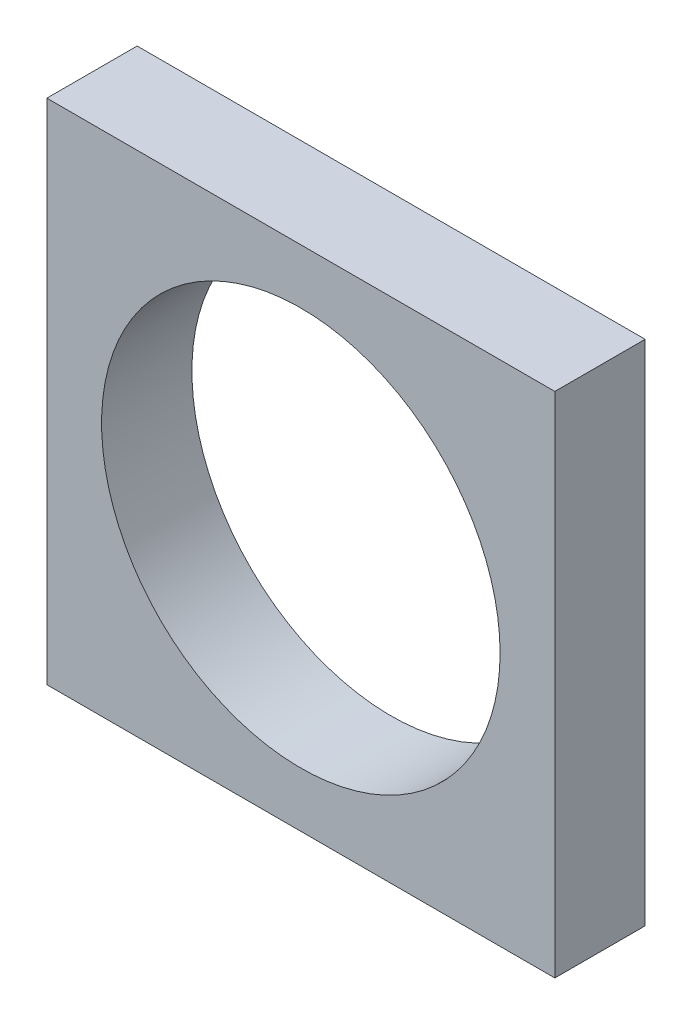
ISO-10303-21;
HEADER;
FILE_DESCRIPTION(('STEP AP214'),'2;1');
FILE_NAME('part.step','',(''),(''),'','','');
FILE_SCHEMA(('AUTOMOTIVE_DESIGN { 1 0 10303 214 1 1 1 1 }'));
ENDSEC;
DATA;
#1=APPLICATION_CONTEXT('core data for automotive mechanical design processes');
#2=APPLICATION_PROTOCOL_DEFINITION('international standard','automotive_design',2000,#1);
#3=PRODUCT_CONTEXT('',#1,'mechanical');
#4=PRODUCT('Part','Part','',(#3));
#5=PRODUCT_RELATED_PRODUCT_CATEGORY('part','',(#4));
#6=PRODUCT_DEFINITION_FORMATION('','',#4);
#7=PRODUCT_DEFINITION_CONTEXT('part definition',#1,'design');
#8=PRODUCT_DEFINITION('design','',#6,#7);
#9=PRODUCT_DEFINITION_SHAPE('','',#8);
#10=(LENGTH_UNIT() NAMED_UNIT(*) SI_UNIT(.MILLI.,.METRE.));
#11=(NAMED_UNIT(*) PLANE_ANGLE_UNIT() SI_UNIT($,.RADIAN.));
#12=(NAMED_UNIT(*) SI_UNIT($,.STERADIAN.) SOLID_ANGLE_UNIT());
#13=UNCERTAINTY_MEASURE_WITH_UNIT(LENGTH_MEASURE(1.E-05),#10,'distance_accuracy_value','');
#14=(GEOMETRIC_REPRESENTATION_CONTEXT(3) GLOBAL_UNCERTAINTY_ASSIGNED_CONTEXT((#13)) GLOBAL_UNIT_ASSIGNED_CONTEXT((#10,
#11,#12)) REPRESENTATION_CONTEXT('',''));
#15=CARTESIAN_POINT('',(0.,0.,0.));
#16=DIRECTION('',(0.,0.,1.));
#17=DIRECTION('',(1.,0.,0.));
#18=AXIS2_PLACEMENT_3D('',#15,#16,#17);
#19=CARTESIAN_POINT('',(0.,0.,8.));
#20=DIRECTION('',(0.,0.,-1.));
#21=DIRECTION('',(-1.,0.,0.));
#22=AXIS2_PLACEMENT_3D('',#19,#20,#21);
#23=PLANE('',#22);
#24=DIRECTION('',(0.,1.,0.));
#25=VECTOR('',#24,1.);
#26=CARTESIAN_POINT('',(22.5,-22.5,8.));
#27=LINE('',#26,#25);
#28=CARTESIAN_POINT('',(22.5,-22.5,8.));
#29=VERTEX_POINT('',#28);
#30=CARTESIAN_POINT('',(22.5,22.5,8.));
#31=VERTEX_POINT('',#30);
#32=EDGE_CURVE('E85',#29,#31,#27,.T.);
#33=ORIENTED_EDGE('',*,*,#32,.T.);
#34=DIRECTION('',(-1.,0.,0.));
#35=VECTOR('',#34,1.);
#36=CARTESIAN_POINT('',(-22.5,22.5,8.));
#37=LINE('',#36,#35);
#38=CARTESIAN_POINT('',(-22.5,22.5,8.));
#39=VERTEX_POINT('',#38);
#40=EDGE_CURVE('E80',#31,#39,#37,.T.);
#41=ORIENTED_EDGE('',*,*,#40,.T.);
#42=DIRECTION('',(0.,-1.,0.));
#43=VECTOR('',#42,1.);
#44=CARTESIAN_POINT('',(-22.5,-22.5,8.));
#45=LINE('',#44,#43);
#46=CARTESIAN_POINT('',(-22.5,-22.5,8.));
#47=VERTEX_POINT('',#46);
#48=EDGE_CURVE('E83',#39,#47,#45,.T.);
#49=ORIENTED_EDGE('',*,*,#48,.T.);
#50=DIRECTION('',(1.,0.,0.));
#51=VECTOR('',#50,1.);
#52=CARTESIAN_POINT('',(-22.5,-22.5,8.));
#53=LINE('',#52,#51);
#54=EDGE_CURVE('E50',#47,#29,#53,.T.);
#55=ORIENTED_EDGE('',*,*,#54,.T.);
#56=EDGE_LOOP('',(#33,#41,#49,#55));
#57=FACE_BOUND('',#56,.T.);
#58=CARTESIAN_POINT('',(0.,0.,8.));
#59=DIRECTION('',(0.,0.,1.));
#60=DIRECTION('',(1.,0.,0.));
#61=AXIS2_PLACEMENT_3D('',#58,#59,#60);
#62=CIRCLE('',#61,17.65);
#63=CARTESIAN_POINT('',(17.65,0.,8.));
#64=VERTEX_POINT('',#63);
#65=EDGE_CURVE('E100',#64,#64,#62,.T.);
#66=ORIENTED_EDGE('',*,*,#65,.F.);
#67=EDGE_LOOP('',(#66));
#68=FACE_BOUND('',#67,.T.);
#69=ADVANCED_FACE('F33',(#57,#68),#23,.F.);
#70=CARTESIAN_POINT('',(0.,0.,0.));
#71=DIRECTION('',(0.,0.,-1.));
#72=DIRECTION('',(-1.,0.,0.));
#73=AXIS2_PLACEMENT_3D('',#70,#71,#72);
#74=PLANE('',#73);
#75=DIRECTION('',(0.,1.,0.));
#76=VECTOR('',#75,1.);
#77=CARTESIAN_POINT('',(22.5,-22.5,0.));
#78=LINE('',#77,#76);
#79=CARTESIAN_POINT('',(22.5,-22.5,0.));
#80=VERTEX_POINT('',#79);
#81=CARTESIAN_POINT('',(22.5,22.5,0.));
#82=VERTEX_POINT('',#81);
#83=EDGE_CURVE('E97',#80,#82,#78,.T.);
#84=ORIENTED_EDGE('',*,*,#83,.F.);
#85=DIRECTION('',(1.,0.,0.));
#86=VECTOR('',#85,1.);
#87=CARTESIAN_POINT('',(-22.5,-22.5,0.));
#88=LINE('',#87,#86);
#89=CARTESIAN_POINT('',(-22.5,-22.5,0.));
#90=VERTEX_POINT('',#89);
#91=EDGE_CURVE('E73',#90,#80,#88,.T.);
#92=ORIENTED_EDGE('',*,*,#91,.F.);
#93=DIRECTION('',(0.,-1.,0.));
#94=VECTOR('',#93,1.);
#95=CARTESIAN_POINT('',(-22.5,-22.5,0.));
#96=LINE('',#95,#94);
#97=CARTESIAN_POINT('',(-22.5,22.5,0.));
#98=VERTEX_POINT('',#97);
#99=EDGE_CURVE('E67',#98,#90,#96,.T.);
#100=ORIENTED_EDGE('',*,*,#99,.F.);
#101=DIRECTION('',(-1.,0.,0.));
#102=VECTOR('',#101,1.);
#103=CARTESIAN_POINT('',(-22.5,22.5,0.));
#104=LINE('',#103,#102);
#105=EDGE_CURVE('E89',#82,#98,#104,.T.);
#106=ORIENTED_EDGE('',*,*,#105,.F.);
#107=EDGE_LOOP('',(#84,#92,#100,#106));
#108=FACE_BOUND('',#107,.T.);
#109=CARTESIAN_POINT('',(0.,0.,0.));
#110=DIRECTION('',(0.,0.,1.));
#111=DIRECTION('',(1.,0.,0.));
#112=AXIS2_PLACEMENT_3D('',#109,#110,#111);
#113=CIRCLE('',#112,17.65);
#114=CARTESIAN_POINT('',(17.65,0.,0.));
#115=VERTEX_POINT('',#114);
#116=EDGE_CURVE('E112',#115,#115,#113,.T.);
#117=ORIENTED_EDGE('',*,*,#116,.T.);
#118=EDGE_LOOP('',(#117));
#119=FACE_BOUND('',#118,.T.);
#120=ADVANCED_FACE('F108',(#108,#119),#74,.T.);
#121=CARTESIAN_POINT('',(22.5,-22.5,8.));
#122=DIRECTION('',(-1.,0.,0.));
#123=DIRECTION('',(0.,0.,1.));
#124=AXIS2_PLACEMENT_3D('',#121,#122,#123);
#125=PLANE('',#124);
#126=ORIENTED_EDGE('',*,*,#83,.T.);
#127=DIRECTION('',(0.,0.,-1.));
#128=VECTOR('',#127,1.);
#129=CARTESIAN_POINT('',(22.5,22.5,8.));
#130=LINE('',#129,#128);
#131=EDGE_CURVE('E11',#31,#82,#130,.T.);
#132=ORIENTED_EDGE('',*,*,#131,.F.);
#133=ORIENTED_EDGE('',*,*,#32,.F.);
#134=DIRECTION('',(0.,0.,-1.));
#135=VECTOR('',#134,1.);
#136=CARTESIAN_POINT('',(22.5,-22.5,8.));
#137=LINE('',#136,#135);
#138=EDGE_CURVE('E93',#29,#80,#137,.T.);
#139=ORIENTED_EDGE('',*,*,#138,.T.);
#140=EDGE_LOOP('',(#126,#132,#133,#139));
#141=FACE_BOUND('',#140,.T.);
#142=ADVANCED_FACE('F35',(#141),#125,.F.);
#143=CARTESIAN_POINT('',(-22.5,22.5,8.));
#144=DIRECTION('',(0.,-1.,0.));
#145=DIRECTION('',(0.,0.,-1.));
#146=AXIS2_PLACEMENT_3D('',#143,#144,#145);
#147=PLANE('',#146);
#148=ORIENTED_EDGE('',*,*,#105,.T.);
#149=DIRECTION('',(0.,0.,-1.));
#150=VECTOR('',#149,1.);
#151=CARTESIAN_POINT('',(-22.5,22.5,8.));
#152=LINE('',#151,#150);
#153=EDGE_CURVE('E42',#39,#98,#152,.T.);
#154=ORIENTED_EDGE('',*,*,#153,.F.);
#155=ORIENTED_EDGE('',*,*,#40,.F.);
#156=ORIENTED_EDGE('',*,*,#131,.T.);
#157=EDGE_LOOP('',(#148,#154,#155,#156));
#158=FACE_BOUND('',#157,.T.);
#159=ADVANCED_FACE('F88',(#158),#147,.F.);
#160=CARTESIAN_POINT('',(-22.5,-22.5,8.));
#161=DIRECTION('',(1.,0.,0.));
#162=DIRECTION('',(0.,0.,-1.));
#163=AXIS2_PLACEMENT_3D('',#160,#161,#162);
#164=PLANE('',#163);
#165=ORIENTED_EDGE('',*,*,#99,.T.);
#166=DIRECTION('',(0.,0.,-1.));
#167=VECTOR('',#166,1.);
#168=CARTESIAN_POINT('',(-22.5,-22.5,8.));
#169=LINE('',#168,#167);
#170=EDGE_CURVE('E90',#47,#90,#169,.T.);
#171=ORIENTED_EDGE('',*,*,#170,.F.);
#172=ORIENTED_EDGE('',*,*,#48,.F.);
#173=ORIENTED_EDGE('',*,*,#153,.T.);
#174=EDGE_LOOP('',(#165,#171,#172,#173));
#175=FACE_BOUND('',#174,.T.);
#176=ADVANCED_FACE('F91',(#175),#164,.F.);
#177=CARTESIAN_POINT('',(-22.5,-22.5,8.));
#178=DIRECTION('',(0.,1.,0.));
#179=DIRECTION('',(0.,0.,1.));
#180=AXIS2_PLACEMENT_3D('',#177,#178,#179);
#181=PLANE('',#180);
#182=ORIENTED_EDGE('',*,*,#91,.T.);
#183=ORIENTED_EDGE('',*,*,#138,.F.);
#184=ORIENTED_EDGE('',*,*,#54,.F.);
#185=ORIENTED_EDGE('',*,*,#170,.T.);
#186=EDGE_LOOP('',(#182,#183,#184,#185));
#187=FACE_BOUND('',#186,.T.);
#188=ADVANCED_FACE('F105',(#187),#181,.F.);
#189=CARTESIAN_POINT('',(0.,0.,8.));
#190=DIRECTION('',(0.,0.,-1.));
#191=DIRECTION('',(-1.,0.,0.));
#192=AXIS2_PLACEMENT_3D('',#189,#190,#191);
#193=CYLINDRICAL_SURFACE('',#192,17.65);
#194=ORIENTED_EDGE('',*,*,#65,.T.);
#195=EDGE_LOOP('',(#194));
#196=FACE_BOUND('',#195,.T.);
#197=ORIENTED_EDGE('',*,*,#116,.F.);
#198=EDGE_LOOP('',(#197));
#199=FACE_BOUND('',#198,.T.);
#200=ADVANCED_FACE('F118',(#196,#199),#193,.F.);
#201=CLOSED_SHELL('',(#69,#120,#142,#159,#176,#188,#200));
#202=MANIFOLD_SOLID_BREP('B2',#201);
#203=ADVANCED_BREP_SHAPE_REPRESENTATION('',(#18,#202),#14);
#204=SHAPE_DEFINITION_REPRESENTATION(#9,#203);
ENDSEC;
END-ISO-10303-21;
